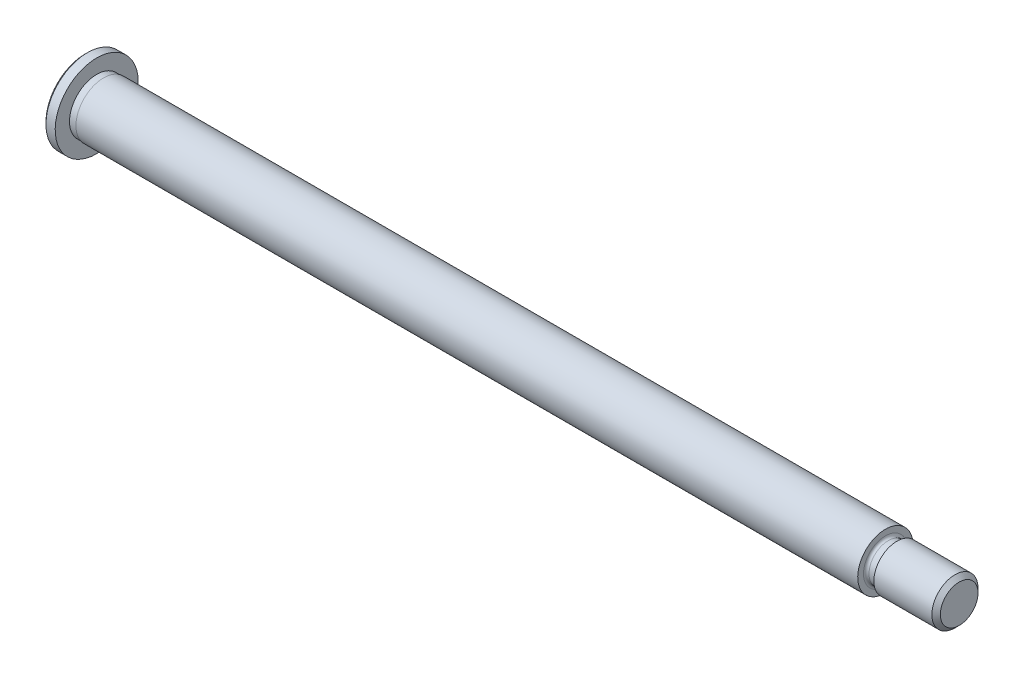
ISO-10303-21;
HEADER;
FILE_DESCRIPTION(('STEP AP214'),'2;1');
FILE_NAME('part.step','',(''),(''),'','','');
FILE_SCHEMA(('AUTOMOTIVE_DESIGN { 1 0 10303 214 1 1 1 1 }'));
ENDSEC;
DATA;
#1=APPLICATION_CONTEXT('core data for automotive mechanical design processes');
#2=APPLICATION_PROTOCOL_DEFINITION('international standard','automotive_design',2000,#1);
#3=PRODUCT_CONTEXT('',#1,'mechanical');
#4=PRODUCT('Part','Part','',(#3));
#5=PRODUCT_RELATED_PRODUCT_CATEGORY('part','',(#4));
#6=PRODUCT_DEFINITION_FORMATION('','',#4);
#7=PRODUCT_DEFINITION_CONTEXT('part definition',#1,'design');
#8=PRODUCT_DEFINITION('design','',#6,#7);
#9=PRODUCT_DEFINITION_SHAPE('','',#8);
#10=(LENGTH_UNIT() NAMED_UNIT(*) SI_UNIT(.MILLI.,.METRE.));
#11=(NAMED_UNIT(*) PLANE_ANGLE_UNIT() SI_UNIT($,.RADIAN.));
#12=(NAMED_UNIT(*) SI_UNIT($,.STERADIAN.) SOLID_ANGLE_UNIT());
#13=UNCERTAINTY_MEASURE_WITH_UNIT(LENGTH_MEASURE(1.E-05),#10,'distance_accuracy_value','');
#14=(GEOMETRIC_REPRESENTATION_CONTEXT(3) GLOBAL_UNCERTAINTY_ASSIGNED_CONTEXT((#13)) GLOBAL_UNIT_ASSIGNED_CONTEXT((#10,
#11,#12)) REPRESENTATION_CONTEXT('',''));
#15=CARTESIAN_POINT('',(0.,0.,0.));
#16=DIRECTION('',(0.,0.,1.));
#17=DIRECTION('',(1.,0.,0.));
#18=AXIS2_PLACEMENT_3D('',#15,#16,#17);
#19=CARTESIAN_POINT('',(0.5,0.,0.));
#20=DIRECTION('',(1.,0.,0.));
#21=DIRECTION('',(0.,0.,-1.));
#22=AXIS2_PLACEMENT_3D('',#19,#20,#21);
#23=PLANE('',#22);
#24=DIRECTION('',(0.,0.499999999999997,-0.86602540378444));
#25=VECTOR('',#24,1.);
#26=CARTESIAN_POINT('',(0.5,-1.73205080756889,-0.999999999999985));
#27=LINE('',#26,#25);
#28=CARTESIAN_POINT('',(0.499999999994088,-1.73205080757302,-1.00000000000237));
#29=VERTEX_POINT('',#28);
#30=CARTESIAN_POINT('',(0.5,-1.15470053837926,-2.));
#31=VERTEX_POINT('',#30);
#32=EDGE_CURVE('E117',#29,#31,#27,.T.);
#33=ORIENTED_EDGE('',*,*,#32,.F.);
#34=CARTESIAN_POINT('',(0.499999999988176,0.,0.));
#35=DIRECTION('',(-1.,0.,0.));
#36=DIRECTION('',(0.,0.,1.));
#37=AXIS2_PLACEMENT_3D('',#34,#35,#36);
#38=CIRCLE('',#37,2.00000000000955);
#39=CARTESIAN_POINT('',(0.499999999994088,0.,-2.00000000000467));
#40=VERTEX_POINT('',#39);
#41=EDGE_CURVE('E120',#29,#40,#38,.F.);
#42=ORIENTED_EDGE('',*,*,#41,.T.);
#43=DIRECTION('',(0.,1.,0.));
#44=VECTOR('',#43,1.);
#45=CARTESIAN_POINT('',(0.5,0.,-2.));
#46=LINE('',#45,#44);
#47=EDGE_CURVE('E107',#31,#40,#46,.T.);
#48=ORIENTED_EDGE('',*,*,#47,.F.);
#49=EDGE_LOOP('',(#33,#42,#48));
#50=FACE_BOUND('',#49,.T.);
#51=ADVANCED_FACE('F17',(#50),#23,.F.);
#52=CARTESIAN_POINT('',(0.5,0.,0.));
#53=DIRECTION('',(1.,0.,0.));
#54=DIRECTION('',(0.,0.,-1.));
#55=AXIS2_PLACEMENT_3D('',#52,#53,#54);
#56=PLANE('',#55);
#57=DIRECTION('',(0.,1.,0.));
#58=VECTOR('',#57,1.);
#59=CARTESIAN_POINT('',(0.5,0.,-1.9999999999998));
#60=LINE('',#59,#58);
#61=CARTESIAN_POINT('',(0.5,1.15470053837933,-1.99999999999987));
#62=VERTEX_POINT('',#61);
#63=EDGE_CURVE('E112',#40,#62,#60,.T.);
#64=ORIENTED_EDGE('',*,*,#63,.F.);
#65=CARTESIAN_POINT('',(0.499999999988176,0.,0.));
#66=DIRECTION('',(-1.,0.,0.));
#67=DIRECTION('',(0.,0.,1.));
#68=AXIS2_PLACEMENT_3D('',#65,#66,#67);
#69=CIRCLE('',#68,2.00000000000955);
#70=CARTESIAN_POINT('',(0.499999999994088,1.73205080757302,-1.00000000000238));
#71=VERTEX_POINT('',#70);
#72=EDGE_CURVE('E124',#40,#71,#69,.F.);
#73=ORIENTED_EDGE('',*,*,#72,.T.);
#74=DIRECTION('',(0.,0.5,0.866025403784439));
#75=VECTOR('',#74,1.);
#76=CARTESIAN_POINT('',(0.5,1.15470053837925,-2.));
#77=LINE('',#76,#75);
#78=EDGE_CURVE('E133',#62,#71,#77,.T.);
#79=ORIENTED_EDGE('',*,*,#78,.F.);
#80=EDGE_LOOP('',(#64,#73,#79));
#81=FACE_BOUND('',#80,.T.);
#82=ADVANCED_FACE('F130',(#81),#56,.F.);
#83=CARTESIAN_POINT('',(0.5,0.,0.));
#84=DIRECTION('',(1.,0.,0.));
#85=DIRECTION('',(0.,0.,-1.));
#86=AXIS2_PLACEMENT_3D('',#83,#84,#85);
#87=PLANE('',#86);
#88=DIRECTION('',(0.,-0.499999999999847,0.866025403784527));
#89=VECTOR('',#88,1.);
#90=CARTESIAN_POINT('',(0.5,1.73205080756872,0.99999999999988));
#91=LINE('',#90,#89);
#92=CARTESIAN_POINT('',(0.499999999994088,1.73205080757303,1.00000000000237));
#93=VERTEX_POINT('',#92);
#94=CARTESIAN_POINT('',(0.5,1.15470053837926,2.));
#95=VERTEX_POINT('',#94);
#96=EDGE_CURVE('E284',#93,#95,#91,.T.);
#97=ORIENTED_EDGE('',*,*,#96,.F.);
#98=CARTESIAN_POINT('',(0.499999999988176,0.,0.));
#99=DIRECTION('',(-1.,0.,0.));
#100=DIRECTION('',(0.,0.,1.));
#101=AXIS2_PLACEMENT_3D('',#98,#99,#100);
#102=CIRCLE('',#101,2.00000000000955);
#103=CARTESIAN_POINT('',(0.499999999994088,0.,2.00000000000477));
#104=VERTEX_POINT('',#103);
#105=EDGE_CURVE('E139',#93,#104,#102,.F.);
#106=ORIENTED_EDGE('',*,*,#105,.T.);
#107=DIRECTION('',(0.,1.,0.));
#108=VECTOR('',#107,1.);
#109=CARTESIAN_POINT('',(0.5,0.,2.));
#110=LINE('',#109,#108);
#111=EDGE_CURVE('E125',#95,#104,#110,.F.);
#112=ORIENTED_EDGE('',*,*,#111,.F.);
#113=EDGE_LOOP('',(#97,#106,#112));
#114=FACE_BOUND('',#113,.T.);
#115=ADVANCED_FACE('F331',(#114),#87,.F.);
#116=CARTESIAN_POINT('',(0.499999999988177,0.,0.));
#117=DIRECTION('',(-1.,0.,0.));
#118=DIRECTION('',(0.,0.,1.));
#119=AXIS2_PLACEMENT_3D('',#116,#117,#118);
#120=CONICAL_SURFACE('',#119,2.00000000000955,1.04719755118114);
#121=CARTESIAN_POINT('',(1.65470053835293,0.,0.));
#122=VERTEX_POINT('',#121);
#123=VERTEX_LOOP('',#122);
#124=FACE_BOUND('',#123,.T.);
#125=ORIENTED_EDGE('',*,*,#41,.F.);
#126=CARTESIAN_POINT('',(0.499999999988176,0.,0.));
#127=DIRECTION('',(-1.,0.,0.));
#128=DIRECTION('',(0.,0.,1.));
#129=AXIS2_PLACEMENT_3D('',#126,#127,#128);
#130=CIRCLE('',#129,2.00000000000955);
#131=CARTESIAN_POINT('',(0.499999999994088,-1.73205080757299,1.00000000000244));
#132=VERTEX_POINT('',#131);
#133=EDGE_CURVE('E101',#132,#29,#130,.F.);
#134=ORIENTED_EDGE('',*,*,#133,.F.);
#135=CARTESIAN_POINT('',(0.499999999988176,0.,0.));
#136=DIRECTION('',(-1.,0.,0.));
#137=DIRECTION('',(0.,0.,1.));
#138=AXIS2_PLACEMENT_3D('',#135,#136,#137);
#139=CIRCLE('',#138,2.00000000000955);
#140=EDGE_CURVE('E280',#132,#104,#139,.T.);
#141=ORIENTED_EDGE('',*,*,#140,.T.);
#142=ORIENTED_EDGE('',*,*,#105,.F.);
#143=CARTESIAN_POINT('',(0.499999999988176,0.,0.));
#144=DIRECTION('',(-1.,0.,0.));
#145=DIRECTION('',(0.,0.,1.));
#146=AXIS2_PLACEMENT_3D('',#143,#144,#145);
#147=CIRCLE('',#146,2.00000000000955);
#148=EDGE_CURVE('E137',#71,#93,#147,.F.);
#149=ORIENTED_EDGE('',*,*,#148,.F.);
#150=ORIENTED_EDGE('',*,*,#72,.F.);
#151=EDGE_LOOP('',(#125,#134,#141,#142,#149,#150));
#152=FACE_BOUND('',#151,.T.);
#153=ADVANCED_FACE('F135',(#124,#152),#120,.F.);
#154=CARTESIAN_POINT('',(0.5,0.,0.));
#155=DIRECTION('',(1.,0.,0.));
#156=DIRECTION('',(0.,0.,-1.));
#157=AXIS2_PLACEMENT_3D('',#154,#155,#156);
#158=PLANE('',#157);
#159=DIRECTION('',(0.,1.,0.));
#160=VECTOR('',#159,1.);
#161=CARTESIAN_POINT('',(0.5,1.15470053837927,2.));
#162=LINE('',#161,#160);
#163=CARTESIAN_POINT('',(0.5,-1.15470053837927,2.));
#164=VERTEX_POINT('',#163);
#165=EDGE_CURVE('E244',#104,#164,#162,.F.);
#166=ORIENTED_EDGE('',*,*,#165,.F.);
#167=ORIENTED_EDGE('',*,*,#140,.F.);
#168=DIRECTION('',(0.,0.499999999999996,0.866025403784441));
#169=VECTOR('',#168,1.);
#170=CARTESIAN_POINT('',(0.5,-1.15470053837927,2.));
#171=LINE('',#170,#169);
#172=EDGE_CURVE('E245',#164,#132,#171,.F.);
#173=ORIENTED_EDGE('',*,*,#172,.F.);
#174=EDGE_LOOP('',(#166,#167,#173));
#175=FACE_BOUND('',#174,.T.);
#176=ADVANCED_FACE('F335',(#175),#158,.F.);
#177=CARTESIAN_POINT('',(0.5,0.,0.));
#178=DIRECTION('',(1.,0.,0.));
#179=DIRECTION('',(0.,0.,-1.));
#180=AXIS2_PLACEMENT_3D('',#177,#178,#179);
#181=PLANE('',#180);
#182=DIRECTION('',(0.,0.499999999999995,-0.866025403784441));
#183=VECTOR('',#182,1.);
#184=CARTESIAN_POINT('',(0.5,2.3094010767585,0.));
#185=LINE('',#184,#183);
#186=CARTESIAN_POINT('',(0.5,2.3094010767585,0.));
#187=VERTEX_POINT('',#186);
#188=EDGE_CURVE('E264',#187,#93,#185,.F.);
#189=ORIENTED_EDGE('',*,*,#188,.F.);
#190=DIRECTION('',(0.,-0.5,-0.866025403784439));
#191=VECTOR('',#190,1.);
#192=CARTESIAN_POINT('',(0.5,1.15470053837925,-2.));
#193=LINE('',#192,#191);
#194=EDGE_CURVE('E253',#71,#187,#193,.F.);
#195=ORIENTED_EDGE('',*,*,#194,.F.);
#196=ORIENTED_EDGE('',*,*,#148,.T.);
#197=EDGE_LOOP('',(#189,#195,#196));
#198=FACE_BOUND('',#197,.T.);
#199=ADVANCED_FACE('F361',(#198),#181,.F.);
#200=CARTESIAN_POINT('',(0.5,0.,0.));
#201=DIRECTION('',(1.,0.,0.));
#202=DIRECTION('',(0.,0.,-1.));
#203=AXIS2_PLACEMENT_3D('',#200,#201,#202);
#204=PLANE('',#203);
#205=DIRECTION('',(0.,0.499999999999996,0.866025403784441));
#206=VECTOR('',#205,1.);
#207=CARTESIAN_POINT('',(0.5,-1.15470053837927,2.));
#208=LINE('',#207,#206);
#209=CARTESIAN_POINT('',(0.5,-2.30940107675851,0.));
#210=VERTEX_POINT('',#209);
#211=EDGE_CURVE('E241',#132,#210,#208,.F.);
#212=ORIENTED_EDGE('',*,*,#211,.F.);
#213=ORIENTED_EDGE('',*,*,#133,.T.);
#214=DIRECTION('',(0.,-0.500000000000001,0.866025403784438));
#215=VECTOR('',#214,1.);
#216=CARTESIAN_POINT('',(0.5,-2.30940107675851,0.));
#217=LINE('',#216,#215);
#218=EDGE_CURVE('E236',#210,#29,#217,.F.);
#219=ORIENTED_EDGE('',*,*,#218,.F.);
#220=EDGE_LOOP('',(#212,#213,#219));
#221=FACE_BOUND('',#220,.T.);
#222=ADVANCED_FACE('F358',(#221),#204,.F.);
#223=CARTESIAN_POINT('',(187.,4.08,0.));
#224=DIRECTION('',(-1.,0.,0.));
#225=DIRECTION('',(0.,-1.,0.));
#226=AXIS2_PLACEMENT_3D('',#223,#224,#225);
#227=PLANE('',#226);
#228=CARTESIAN_POINT('',(186.999999999955,0.,0.));
#229=DIRECTION('',(-1.,0.,0.));
#230=DIRECTION('',(0.,0.,1.));
#231=AXIS2_PLACEMENT_3D('',#228,#229,#230);
#232=CIRCLE('',#231,4.08000000004449);
#233=CARTESIAN_POINT('',(186.999999999955,0.,4.08000000004449));
#234=VERTEX_POINT('',#233);
#235=EDGE_CURVE('E232',#234,#234,#232,.T.);
#236=ORIENTED_EDGE('',*,*,#235,.F.);
#237=EDGE_LOOP('',(#236));
#238=FACE_BOUND('',#237,.T.);
#239=ADVANCED_FACE('F360',(#238),#227,.F.);
#240=CARTESIAN_POINT('',(0.5,-1.15470053837927,2.));
#241=DIRECTION('',(0.,0.866025403784441,-0.499999999999996));
#242=DIRECTION('',(0.,0.499999999999996,0.866025403784441));
#243=AXIS2_PLACEMENT_3D('',#240,#241,#242);
#244=PLANE('',#243);
#245=DIRECTION('',(0.,0.499999999999996,0.866025403784441));
#246=VECTOR('',#245,1.);
#247=CARTESIAN_POINT('',(-2.5,-2.30940107675851,0.));
#248=LINE('',#247,#246);
#249=CARTESIAN_POINT('',(-2.5,-2.30940107675851,0.));
#250=VERTEX_POINT('',#249);
#251=CARTESIAN_POINT('',(-2.5,-1.15470053837927,2.));
#252=VERTEX_POINT('',#251);
#253=EDGE_CURVE('E230',#250,#252,#248,.T.);
#254=ORIENTED_EDGE('',*,*,#253,.T.);
#255=DIRECTION('',(-1.,0.,0.));
#256=VECTOR('',#255,1.);
#257=CARTESIAN_POINT('',(0.5,-1.15470053837927,2.));
#258=LINE('',#257,#256);
#259=EDGE_CURVE('E267',#164,#252,#258,.T.);
#260=ORIENTED_EDGE('',*,*,#259,.F.);
#261=ORIENTED_EDGE('',*,*,#172,.T.);
#262=ORIENTED_EDGE('',*,*,#211,.T.);
#263=DIRECTION('',(1.,0.,0.));
#264=VECTOR('',#263,1.);
#265=CARTESIAN_POINT('',(0.5,-2.30940107675851,0.));
#266=LINE('',#265,#264);
#267=EDGE_CURVE('E248',#250,#210,#266,.T.);
#268=ORIENTED_EDGE('',*,*,#267,.F.);
#269=EDGE_LOOP('',(#254,#260,#261,#262,#268));
#270=FACE_BOUND('',#269,.T.);
#271=ADVANCED_FACE('F357',(#270),#244,.T.);
#272=CARTESIAN_POINT('',(0.5,1.15470053837927,2.));
#273=DIRECTION('',(0.,0.,-1.));
#274=DIRECTION('',(-1.,0.,0.));
#275=AXIS2_PLACEMENT_3D('',#272,#273,#274);
#276=PLANE('',#275);
#277=DIRECTION('',(0.,1.,0.));
#278=VECTOR('',#277,1.);
#279=CARTESIAN_POINT('',(-2.5,2.,2.));
#280=LINE('',#279,#278);
#281=CARTESIAN_POINT('',(-2.5,1.15470053837926,2.));
#282=VERTEX_POINT('',#281);
#283=EDGE_CURVE('E228',#252,#282,#280,.T.);
#284=ORIENTED_EDGE('',*,*,#283,.T.);
#285=DIRECTION('',(1.,0.,0.));
#286=VECTOR('',#285,1.);
#287=CARTESIAN_POINT('',(0.5,1.15470053837926,2.));
#288=LINE('',#287,#286);
#289=EDGE_CURVE('E257',#95,#282,#288,.F.);
#290=ORIENTED_EDGE('',*,*,#289,.F.);
#291=ORIENTED_EDGE('',*,*,#111,.T.);
#292=ORIENTED_EDGE('',*,*,#165,.T.);
#293=ORIENTED_EDGE('',*,*,#259,.T.);
#294=EDGE_LOOP('',(#284,#290,#291,#292,#293));
#295=FACE_BOUND('',#294,.T.);
#296=ADVANCED_FACE('F338',(#295),#276,.T.);
#297=CARTESIAN_POINT('',(0.5,2.3094010767585,0.));
#298=DIRECTION('',(0.,-0.866025403784441,-0.499999999999995));
#299=DIRECTION('',(0.,0.499999999999995,-0.866025403784441));
#300=AXIS2_PLACEMENT_3D('',#297,#298,#299);
#301=PLANE('',#300);
#302=DIRECTION('',(0.,0.499999999999996,-0.866025403784441));
#303=VECTOR('',#302,1.);
#304=CARTESIAN_POINT('',(-2.5,1.15470053837926,2.));
#305=LINE('',#304,#303);
#306=CARTESIAN_POINT('',(-2.5,2.3094010767585,0.));
#307=VERTEX_POINT('',#306);
#308=EDGE_CURVE('E226',#282,#307,#305,.T.);
#309=ORIENTED_EDGE('',*,*,#308,.T.);
#310=DIRECTION('',(1.,0.,0.));
#311=VECTOR('',#310,1.);
#312=CARTESIAN_POINT('',(0.5,2.3094010767585,0.));
#313=LINE('',#312,#311);
#314=EDGE_CURVE('E256',#187,#307,#313,.F.);
#315=ORIENTED_EDGE('',*,*,#314,.F.);
#316=ORIENTED_EDGE('',*,*,#188,.T.);
#317=ORIENTED_EDGE('',*,*,#96,.T.);
#318=ORIENTED_EDGE('',*,*,#289,.T.);
#319=EDGE_LOOP('',(#309,#315,#316,#317,#318));
#320=FACE_BOUND('',#319,.T.);
#321=ADVANCED_FACE('F343',(#320),#301,.T.);
#322=CARTESIAN_POINT('',(0.5,1.15470053837925,-2.));
#323=DIRECTION('',(0.,-0.866025403784439,0.5));
#324=DIRECTION('',(0.,-0.5,-0.866025403784439));
#325=AXIS2_PLACEMENT_3D('',#322,#323,#324);
#326=PLANE('',#325);
#327=DIRECTION('',(0.,-0.5,-0.866025403784439));
#328=VECTOR('',#327,1.);
#329=CARTESIAN_POINT('',(-2.5,2.3094010767585,0.));
#330=LINE('',#329,#328);
#331=CARTESIAN_POINT('',(-2.5,1.15470053837925,-2.));
#332=VERTEX_POINT('',#331);
#333=EDGE_CURVE('E224',#307,#332,#330,.T.);
#334=ORIENTED_EDGE('',*,*,#333,.T.);
#335=DIRECTION('',(1.,0.,0.));
#336=VECTOR('',#335,1.);
#337=CARTESIAN_POINT('',(0.5,1.15470053837925,-2.));
#338=LINE('',#337,#336);
#339=EDGE_CURVE('E238',#62,#332,#338,.F.);
#340=ORIENTED_EDGE('',*,*,#339,.F.);
#341=ORIENTED_EDGE('',*,*,#78,.T.);
#342=ORIENTED_EDGE('',*,*,#194,.T.);
#343=ORIENTED_EDGE('',*,*,#314,.T.);
#344=EDGE_LOOP('',(#334,#340,#341,#342,#343));
#345=FACE_BOUND('',#344,.T.);
#346=ADVANCED_FACE('F353',(#345),#326,.T.);
#347=CARTESIAN_POINT('',(0.5,-1.15470053837925,-2.));
#348=DIRECTION('',(0.,0.,1.));
#349=DIRECTION('',(1.,0.,0.));
#350=AXIS2_PLACEMENT_3D('',#347,#348,#349);
#351=PLANE('',#350);
#352=DIRECTION('',(0.,1.,0.));
#353=VECTOR('',#352,1.);
#354=CARTESIAN_POINT('',(-2.5,2.,-2.));
#355=LINE('',#354,#353);
#356=CARTESIAN_POINT('',(-2.5,-1.15470053837925,-2.));
#357=VERTEX_POINT('',#356);
#358=EDGE_CURVE('E222',#332,#357,#355,.F.);
#359=ORIENTED_EDGE('',*,*,#358,.T.);
#360=DIRECTION('',(1.,0.,0.));
#361=VECTOR('',#360,1.);
#362=CARTESIAN_POINT('',(0.5,-1.15470053837926,-2.));
#363=LINE('',#362,#361);
#364=EDGE_CURVE('E115',#31,#357,#363,.F.);
#365=ORIENTED_EDGE('',*,*,#364,.F.);
#366=ORIENTED_EDGE('',*,*,#47,.T.);
#367=ORIENTED_EDGE('',*,*,#63,.T.);
#368=ORIENTED_EDGE('',*,*,#339,.T.);
#369=EDGE_LOOP('',(#359,#365,#366,#367,#368));
#370=FACE_BOUND('',#369,.T.);
#371=ADVANCED_FACE('F109',(#370),#351,.T.);
#372=CARTESIAN_POINT('',(0.5,-2.30940107675851,0.));
#373=DIRECTION('',(0.,0.866025403784438,0.500000000000001));
#374=DIRECTION('',(0.,-0.500000000000001,0.866025403784438));
#375=AXIS2_PLACEMENT_3D('',#372,#373,#374);
#376=PLANE('',#375);
#377=DIRECTION('',(0.,-0.500000000000003,0.866025403784437));
#378=VECTOR('',#377,1.);
#379=CARTESIAN_POINT('',(-2.5,-1.15470053837925,-2.));
#380=LINE('',#379,#378);
#381=EDGE_CURVE('E218',#357,#250,#380,.T.);
#382=ORIENTED_EDGE('',*,*,#381,.T.);
#383=ORIENTED_EDGE('',*,*,#267,.T.);
#384=ORIENTED_EDGE('',*,*,#218,.T.);
#385=ORIENTED_EDGE('',*,*,#32,.T.);
#386=ORIENTED_EDGE('',*,*,#364,.T.);
#387=EDGE_LOOP('',(#382,#383,#384,#385,#386));
#388=FACE_BOUND('',#387,.T.);
#389=ADVANCED_FACE('F355',(#388),#376,.T.);
#390=CARTESIAN_POINT('',(186.080000000004,0.,0.));
#391=DIRECTION('',(-1.,0.,0.));
#392=DIRECTION('',(0.,0.,1.));
#393=AXIS2_PLACEMENT_3D('',#390,#391,#392);
#394=CONICAL_SURFACE('',#393,4.99999999999545,0.785398163397448);
#395=ORIENTED_EDGE('',*,*,#235,.T.);
#396=EDGE_LOOP('',(#395));
#397=FACE_BOUND('',#396,.T.);
#398=CARTESIAN_POINT('',(186.08,0.,0.));
#399=DIRECTION('',(-1.,0.,0.));
#400=DIRECTION('',(0.,-1.,0.));
#401=AXIS2_PLACEMENT_3D('',#398,#399,#400);
#402=CIRCLE('',#401,5.);
#403=CARTESIAN_POINT('',(186.08,-5.,0.));
#404=VERTEX_POINT('',#403);
#405=EDGE_CURVE('E221',#404,#404,#402,.T.);
#406=ORIENTED_EDGE('',*,*,#405,.F.);
#407=EDGE_LOOP('',(#406));
#408=FACE_BOUND('',#407,.T.);
#409=ADVANCED_FACE('F431',(#397,#408),#394,.T.);
#410=CARTESIAN_POINT('',(-2.5,2.,0.));
#411=DIRECTION('',(1.,0.,0.));
#412=DIRECTION('',(0.,1.,0.));
#413=AXIS2_PLACEMENT_3D('',#410,#411,#412);
#414=PLANE('',#413);
#415=ORIENTED_EDGE('',*,*,#358,.F.);
#416=ORIENTED_EDGE('',*,*,#333,.F.);
#417=ORIENTED_EDGE('',*,*,#308,.F.);
#418=ORIENTED_EDGE('',*,*,#283,.F.);
#419=ORIENTED_EDGE('',*,*,#253,.F.);
#420=ORIENTED_EDGE('',*,*,#381,.F.);
#421=EDGE_LOOP('',(#415,#416,#417,#418,#419,#420));
#422=FACE_BOUND('',#421,.T.);
#423=CARTESIAN_POINT('',(-2.49999999999773,0.,0.));
#424=DIRECTION('',(1.,0.,0.));
#425=DIRECTION('',(0.,0.,-1.));
#426=AXIS2_PLACEMENT_3D('',#423,#424,#425);
#427=CIRCLE('',#426,8.49999999991269);
#428=CARTESIAN_POINT('',(-2.49999999999773,0.,-8.49999999991269));
#429=VERTEX_POINT('',#428);
#430=EDGE_CURVE('E235',#429,#429,#427,.T.);
#431=ORIENTED_EDGE('',*,*,#430,.F.);
#432=EDGE_LOOP('',(#431));
#433=FACE_BOUND('',#432,.T.);
#434=ADVANCED_FACE('F348',(#422,#433),#414,.F.);
#435=CARTESIAN_POINT('',(187.,0.,0.));
#436=DIRECTION('',(-1.,0.,0.));
#437=DIRECTION('',(0.,-1.,0.));
#438=AXIS2_PLACEMENT_3D('',#435,#436,#437);
#439=CYLINDRICAL_SURFACE('',#438,5.);
#440=ORIENTED_EDGE('',*,*,#405,.T.);
#441=EDGE_LOOP('',(#440));
#442=FACE_BOUND('',#441,.T.);
#443=CARTESIAN_POINT('',(173.5,0.,0.));
#444=DIRECTION('',(-1.,0.,0.));
#445=DIRECTION('',(0.,-1.,0.));
#446=AXIS2_PLACEMENT_3D('',#443,#444,#445);
#447=CIRCLE('',#446,5.);
#448=CARTESIAN_POINT('',(173.5,-5.,0.));
#449=VERTEX_POINT('',#448);
#450=EDGE_CURVE('E217',#449,#449,#447,.F.);
#451=ORIENTED_EDGE('',*,*,#450,.T.);
#452=EDGE_LOOP('',(#451));
#453=FACE_BOUND('',#452,.T.);
#454=ADVANCED_FACE('F417',(#442,#453),#439,.T.);
#455=CARTESIAN_POINT('',(-2.00000000000955,0.,0.));
#456=DIRECTION('',(1.,0.,0.));
#457=DIRECTION('',(0.,0.,-1.));
#458=AXIS2_PLACEMENT_3D('',#455,#456,#457);
#459=CONICAL_SURFACE('',#458,8.99999999995771,0.785398163454292);
#460=ORIENTED_EDGE('',*,*,#430,.T.);
#461=EDGE_LOOP('',(#460));
#462=FACE_BOUND('',#461,.T.);
#463=CARTESIAN_POINT('',(-2.,0.,0.));
#464=DIRECTION('',(-1.,0.,0.));
#465=DIRECTION('',(0.,-1.,0.));
#466=AXIS2_PLACEMENT_3D('',#463,#464,#465);
#467=CIRCLE('',#466,9.);
#468=CARTESIAN_POINT('',(-2.,-9.,0.));
#469=VERTEX_POINT('',#468);
#470=EDGE_CURVE('E208',#469,#469,#467,.F.);
#471=ORIENTED_EDGE('',*,*,#470,.F.);
#472=EDGE_LOOP('',(#471));
#473=FACE_BOUND('',#472,.T.);
#474=ADVANCED_FACE('F415',(#462,#473),#459,.T.);
#475=CARTESIAN_POINT('',(173.5,4.75,0.));
#476=DIRECTION('',(1.,0.,0.));
#477=DIRECTION('',(0.,1.,0.));
#478=AXIS2_PLACEMENT_3D('',#475,#476,#477);
#479=PLANE('',#478);
#480=ORIENTED_EDGE('',*,*,#450,.F.);
#481=EDGE_LOOP('',(#480));
#482=FACE_BOUND('',#481,.T.);
#483=CARTESIAN_POINT('',(173.5,0.,0.));
#484=DIRECTION('',(-1.,0.,0.));
#485=DIRECTION('',(0.,1.,0.));
#486=AXIS2_PLACEMENT_3D('',#483,#484,#485);
#487=CIRCLE('',#486,4.75000000000002);
#488=CARTESIAN_POINT('',(173.5,-4.75000000000002,0.));
#489=VERTEX_POINT('',#488);
#490=CARTESIAN_POINT('',(173.5,4.75000000000002,0.));
#491=VERTEX_POINT('',#490);
#492=EDGE_CURVE('E216',#489,#491,#487,.F.);
#493=ORIENTED_EDGE('',*,*,#492,.T.);
#494=CARTESIAN_POINT('',(173.5,0.,0.));
#495=DIRECTION('',(-1.,0.,0.));
#496=DIRECTION('',(0.,-1.,0.));
#497=AXIS2_PLACEMENT_3D('',#494,#495,#496);
#498=CIRCLE('',#497,4.75000000000002);
#499=EDGE_CURVE('E318',#491,#489,#498,.F.);
#500=ORIENTED_EDGE('',*,*,#499,.T.);
#501=EDGE_LOOP('',(#493,#500));
#502=FACE_BOUND('',#501,.T.);
#503=ADVANCED_FACE('F412',(#482,#502),#479,.F.);
#504=CARTESIAN_POINT('',(188.,0.,0.));
#505=DIRECTION('',(-1.,0.,0.));
#506=DIRECTION('',(0.,-1.,0.));
#507=AXIS2_PLACEMENT_3D('',#504,#505,#506);
#508=CYLINDRICAL_SURFACE('',#507,9.);
#509=CARTESIAN_POINT('',(0.,0.,0.));
#510=DIRECTION('',(-1.,0.,0.));
#511=DIRECTION('',(0.,-1.,0.));
#512=AXIS2_PLACEMENT_3D('',#509,#510,#511);
#513=CIRCLE('',#512,9.);
#514=CARTESIAN_POINT('',(0.,-9.,0.));
#515=VERTEX_POINT('',#514);
#516=EDGE_CURVE('E187',#515,#515,#513,.T.);
#517=ORIENTED_EDGE('',*,*,#516,.T.);
#518=EDGE_LOOP('',(#517));
#519=FACE_BOUND('',#518,.T.);
#520=ORIENTED_EDGE('',*,*,#470,.T.);
#521=EDGE_LOOP('',(#520));
#522=FACE_BOUND('',#521,.T.);
#523=ADVANCED_FACE('F197',(#519,#522),#508,.T.);
#524=CARTESIAN_POINT('',(172.9,0.,0.));
#525=DIRECTION('',(1.,0.,0.));
#526=DIRECTION('',(0.,1.,0.));
#527=AXIS2_PLACEMENT_3D('',#524,#525,#526);
#528=TOROIDAL_SURFACE('',#527,4.75000000000002,0.600000000000022);
#529=CARTESIAN_POINT('',(172.9,0.,0.));
#530=DIRECTION('',(-1.,0.,0.));
#531=DIRECTION('',(0.,-1.,0.));
#532=AXIS2_PLACEMENT_3D('',#529,#530,#531);
#533=CIRCLE('',#532,4.15);
#534=CARTESIAN_POINT('',(172.9,-4.15,0.));
#535=VERTEX_POINT('',#534);
#536=EDGE_CURVE('E184',#535,#535,#533,.T.);
#537=ORIENTED_EDGE('',*,*,#536,.F.);
#538=EDGE_LOOP('',(#537));
#539=FACE_BOUND('',#538,.T.);
#540=ORIENTED_EDGE('',*,*,#499,.F.);
#541=ORIENTED_EDGE('',*,*,#492,.F.);
#542=EDGE_LOOP('',(#540,#541));
#543=FACE_BOUND('',#542,.T.);
#544=ADVANCED_FACE('F191',(#539,#543),#528,.F.);
#545=CARTESIAN_POINT('',(0.,9.,0.));
#546=DIRECTION('',(-1.,0.,0.));
#547=DIRECTION('',(0.,-1.,0.));
#548=AXIS2_PLACEMENT_3D('',#545,#546,#547);
#549=PLANE('',#548);
#550=CARTESIAN_POINT('',(0.,0.,0.));
#551=DIRECTION('',(-1.,0.,0.));
#552=DIRECTION('',(0.,-1.,0.));
#553=AXIS2_PLACEMENT_3D('',#550,#551,#552);
#554=CIRCLE('',#553,5.9);
#555=CARTESIAN_POINT('',(0.,-5.9,0.));
#556=VERTEX_POINT('',#555);
#557=EDGE_CURVE('E183',#556,#556,#554,.F.);
#558=ORIENTED_EDGE('',*,*,#557,.F.);
#559=EDGE_LOOP('',(#558));
#560=FACE_BOUND('',#559,.T.);
#561=ORIENTED_EDGE('',*,*,#516,.F.);
#562=EDGE_LOOP('',(#561));
#563=FACE_BOUND('',#562,.T.);
#564=ADVANCED_FACE('F196',(#560,#563),#549,.F.);
#565=CARTESIAN_POINT('',(187.,0.,0.));
#566=DIRECTION('',(-1.,0.,0.));
#567=DIRECTION('',(0.,-1.,0.));
#568=AXIS2_PLACEMENT_3D('',#565,#566,#567);
#569=CYLINDRICAL_SURFACE('',#568,4.15);
#570=CARTESIAN_POINT('',(171.6,0.,0.));
#571=DIRECTION('',(1.,0.,0.));
#572=DIRECTION('',(0.,1.,0.));
#573=AXIS2_PLACEMENT_3D('',#570,#571,#572);
#574=CIRCLE('',#573,4.14999999999999);
#575=CARTESIAN_POINT('',(171.6,4.14999999999999,0.));
#576=VERTEX_POINT('',#575);
#577=EDGE_CURVE('E174',#576,#576,#574,.T.);
#578=ORIENTED_EDGE('',*,*,#577,.T.);
#579=EDGE_LOOP('',(#578));
#580=FACE_BOUND('',#579,.T.);
#581=ORIENTED_EDGE('',*,*,#536,.T.);
#582=EDGE_LOOP('',(#581));
#583=FACE_BOUND('',#582,.T.);
#584=ADVANCED_FACE('F403',(#580,#583),#569,.T.);
#585=CARTESIAN_POINT('',(188.,0.,0.));
#586=DIRECTION('',(-1.,0.,0.));
#587=DIRECTION('',(0.,-1.,0.));
#588=AXIS2_PLACEMENT_3D('',#585,#586,#587);
#589=CYLINDRICAL_SURFACE('',#588,5.9);
#590=CARTESIAN_POINT('',(1.5,0.,0.));
#591=DIRECTION('',(-1.,0.,0.));
#592=DIRECTION('',(0.,-1.,0.));
#593=AXIS2_PLACEMENT_3D('',#590,#591,#592);
#594=CIRCLE('',#593,5.9);
#595=CARTESIAN_POINT('',(1.5,-5.9,0.));
#596=VERTEX_POINT('',#595);
#597=EDGE_CURVE('E182',#596,#596,#594,.T.);
#598=ORIENTED_EDGE('',*,*,#597,.T.);
#599=EDGE_LOOP('',(#598));
#600=FACE_BOUND('',#599,.T.);
#601=ORIENTED_EDGE('',*,*,#557,.T.);
#602=EDGE_LOOP('',(#601));
#603=FACE_BOUND('',#602,.T.);
#604=ADVANCED_FACE('F158',(#600,#603),#589,.T.);
#605=CARTESIAN_POINT('',(171.6,0.,0.));
#606=DIRECTION('',(1.,0.,0.));
#607=DIRECTION('',(0.,1.,0.));
#608=AXIS2_PLACEMENT_3D('',#605,#606,#607);
#609=TOROIDAL_SURFACE('',#608,4.75000000000001,0.600000000000017);
#610=ORIENTED_EDGE('',*,*,#577,.F.);
#611=EDGE_LOOP('',(#610));
#612=FACE_BOUND('',#611,.T.);
#613=CARTESIAN_POINT('',(171.,0.,0.));
#614=DIRECTION('',(1.,0.,0.));
#615=DIRECTION('',(0.,1.,0.));
#616=AXIS2_PLACEMENT_3D('',#613,#614,#615);
#617=CIRCLE('',#616,4.75000000000001);
#618=CARTESIAN_POINT('',(171.,4.75000000000001,0.));
#619=VERTEX_POINT('',#618);
#620=CARTESIAN_POINT('',(171.,-4.75000000000001,0.));
#621=VERTEX_POINT('',#620);
#622=EDGE_CURVE('E170',#619,#621,#617,.T.);
#623=ORIENTED_EDGE('',*,*,#622,.T.);
#624=CARTESIAN_POINT('',(171.,0.,0.));
#625=DIRECTION('',(1.,0.,0.));
#626=DIRECTION('',(0.,-1.,0.));
#627=AXIS2_PLACEMENT_3D('',#624,#625,#626);
#628=CIRCLE('',#627,4.75000000000001);
#629=EDGE_CURVE('E36',#621,#619,#628,.T.);
#630=ORIENTED_EDGE('',*,*,#629,.T.);
#631=EDGE_LOOP('',(#623,#630));
#632=FACE_BOUND('',#631,.T.);
#633=ADVANCED_FACE('F146',(#612,#632),#609,.F.);
#634=CARTESIAN_POINT('',(1.5,5.9,0.));
#635=DIRECTION('',(1.,0.,0.));
#636=DIRECTION('',(0.,1.,0.));
#637=AXIS2_PLACEMENT_3D('',#634,#635,#636);
#638=PLANE('',#637);
#639=CARTESIAN_POINT('',(1.5,0.,0.));
#640=DIRECTION('',(-1.,0.,0.));
#641=DIRECTION('',(0.,-1.,0.));
#642=AXIS2_PLACEMENT_3D('',#639,#640,#641);
#643=CIRCLE('',#642,6.);
#644=CARTESIAN_POINT('',(1.5,-6.,0.));
#645=VERTEX_POINT('',#644);
#646=EDGE_CURVE('E28',#645,#645,#643,.F.);
#647=ORIENTED_EDGE('',*,*,#646,.F.);
#648=EDGE_LOOP('',(#647));
#649=FACE_BOUND('',#648,.T.);
#650=ORIENTED_EDGE('',*,*,#597,.F.);
#651=EDGE_LOOP('',(#650));
#652=FACE_BOUND('',#651,.T.);
#653=ADVANCED_FACE('F157',(#649,#652),#638,.F.);
#654=CARTESIAN_POINT('',(171.,6.,0.));
#655=DIRECTION('',(-1.,0.,0.));
#656=DIRECTION('',(0.,-1.,0.));
#657=AXIS2_PLACEMENT_3D('',#654,#655,#656);
#658=PLANE('',#657);
#659=CARTESIAN_POINT('',(171.,0.,0.));
#660=DIRECTION('',(-1.,0.,0.));
#661=DIRECTION('',(0.,-1.,0.));
#662=AXIS2_PLACEMENT_3D('',#659,#660,#661);
#663=CIRCLE('',#662,6.);
#664=CARTESIAN_POINT('',(171.,-6.,0.));
#665=VERTEX_POINT('',#664);
#666=EDGE_CURVE('E11',#665,#665,#663,.T.);
#667=ORIENTED_EDGE('',*,*,#666,.F.);
#668=EDGE_LOOP('',(#667));
#669=FACE_BOUND('',#668,.T.);
#670=ORIENTED_EDGE('',*,*,#629,.F.);
#671=ORIENTED_EDGE('',*,*,#622,.F.);
#672=EDGE_LOOP('',(#670,#671));
#673=FACE_BOUND('',#672,.T.);
#674=ADVANCED_FACE('F374',(#669,#673),#658,.F.);
#675=CARTESIAN_POINT('',(188.,0.,0.));
#676=DIRECTION('',(-1.,0.,0.));
#677=DIRECTION('',(0.,-1.,0.));
#678=AXIS2_PLACEMENT_3D('',#675,#676,#677);
#679=CYLINDRICAL_SURFACE('',#678,6.);
#680=ORIENTED_EDGE('',*,*,#666,.T.);
#681=EDGE_LOOP('',(#680));
#682=FACE_BOUND('',#681,.T.);
#683=ORIENTED_EDGE('',*,*,#646,.T.);
#684=EDGE_LOOP('',(#683));
#685=FACE_BOUND('',#684,.T.);
#686=ADVANCED_FACE('F372',(#682,#685),#679,.T.);
#687=CLOSED_SHELL('',(#51,#82,#115,#153,#176,#199,#222,#239,#271,#296,#321,#346,#371,#389,#409,
#434,#454,#474,#503,#523,#544,#564,#584,#604,#633,#653,#674,#686));
#688=MANIFOLD_SOLID_BREP('B1',#687);
#689=ADVANCED_BREP_SHAPE_REPRESENTATION('',(#18,#688),#14);
#690=SHAPE_DEFINITION_REPRESENTATION(#9,#689);
ENDSEC;
END-ISO-10303-21;
